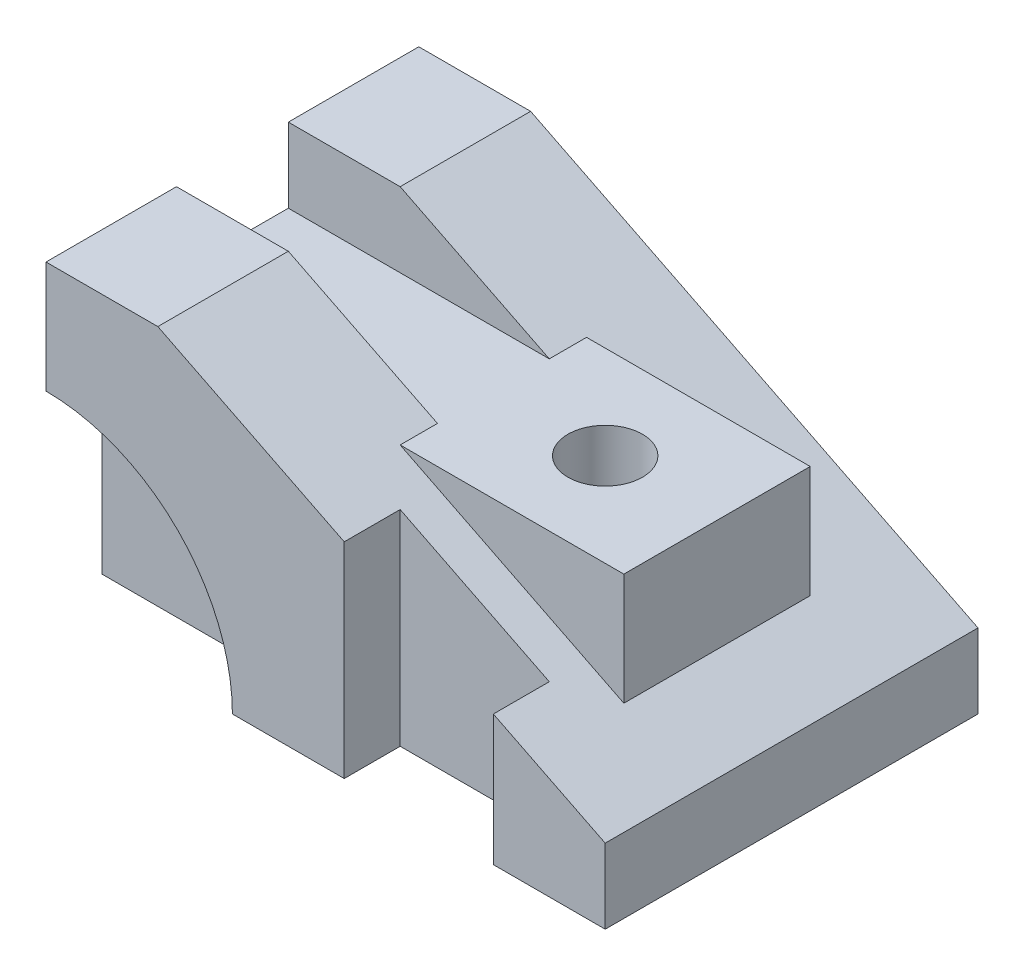
ISO-10303-21;
HEADER;
FILE_DESCRIPTION(('STEP AP214'),'2;1');
FILE_NAME('part.step','',(''),(''),'','','');
FILE_SCHEMA(('AUTOMOTIVE_DESIGN { 1 0 10303 214 1 1 1 1 }'));
ENDSEC;
DATA;
#1=APPLICATION_CONTEXT('core data for automotive mechanical design processes');
#2=APPLICATION_PROTOCOL_DEFINITION('international standard','automotive_design',2000,#1);
#3=PRODUCT_CONTEXT('',#1,'mechanical');
#4=PRODUCT('Part','Part','',(#3));
#5=PRODUCT_RELATED_PRODUCT_CATEGORY('part','',(#4));
#6=PRODUCT_DEFINITION_FORMATION('','',#4);
#7=PRODUCT_DEFINITION_CONTEXT('part definition',#1,'design');
#8=PRODUCT_DEFINITION('design','',#6,#7);
#9=PRODUCT_DEFINITION_SHAPE('','',#8);
#10=(LENGTH_UNIT() NAMED_UNIT(*) SI_UNIT(.MILLI.,.METRE.));
#11=(NAMED_UNIT(*) PLANE_ANGLE_UNIT() SI_UNIT($,.RADIAN.));
#12=(NAMED_UNIT(*) SI_UNIT($,.STERADIAN.) SOLID_ANGLE_UNIT());
#13=UNCERTAINTY_MEASURE_WITH_UNIT(LENGTH_MEASURE(1.E-05),#10,'distance_accuracy_value','');
#14=(GEOMETRIC_REPRESENTATION_CONTEXT(3) GLOBAL_UNCERTAINTY_ASSIGNED_CONTEXT((#13)) GLOBAL_UNIT_ASSIGNED_CONTEXT((#10,
#11,#12)) REPRESENTATION_CONTEXT('',''));
#15=CARTESIAN_POINT('',(0.,0.,0.));
#16=DIRECTION('',(0.,0.,1.));
#17=DIRECTION('',(1.,0.,0.));
#18=AXIS2_PLACEMENT_3D('',#15,#16,#17);
#19=CARTESIAN_POINT('',(0.,0.,50.));
#20=DIRECTION('',(0.,0.,1.));
#21=DIRECTION('',(1.,0.,0.));
#22=AXIS2_PLACEMENT_3D('',#19,#20,#21);
#23=PLANE('',#22);
#24=DIRECTION('',(0.,-1.,0.));
#25=VECTOR('',#24,1.);
#26=CARTESIAN_POINT('',(80.,0.,50.));
#27=LINE('',#26,#25);
#28=CARTESIAN_POINT('',(80.,55.,50.));
#29=VERTEX_POINT('',#28);
#30=CARTESIAN_POINT('',(80.,0.,50.));
#31=VERTEX_POINT('',#30);
#32=EDGE_CURVE('E53',#29,#31,#27,.T.);
#33=ORIENTED_EDGE('',*,*,#32,.F.);
#34=DIRECTION('',(-0.894427190999916,0.447213595499958,0.));
#35=VECTOR('',#34,1.);
#36=CARTESIAN_POINT('',(150.,20.,50.));
#37=LINE('',#36,#35);
#38=CARTESIAN_POINT('',(30.,80.,50.));
#39=VERTEX_POINT('',#38);
#40=EDGE_CURVE('E334',#29,#39,#37,.T.);
#41=ORIENTED_EDGE('',*,*,#40,.T.);
#42=DIRECTION('',(-1.,0.,0.));
#43=VECTOR('',#42,1.);
#44=CARTESIAN_POINT('',(30.,80.,50.));
#45=LINE('',#44,#43);
#46=CARTESIAN_POINT('',(0.,80.,50.));
#47=VERTEX_POINT('',#46);
#48=EDGE_CURVE('E339',#39,#47,#45,.T.);
#49=ORIENTED_EDGE('',*,*,#48,.T.);
#50=DIRECTION('',(0.,-1.,0.));
#51=VECTOR('',#50,1.);
#52=CARTESIAN_POINT('',(0.,80.,50.));
#53=LINE('',#52,#51);
#54=CARTESIAN_POINT('',(0.,50.,50.));
#55=VERTEX_POINT('',#54);
#56=EDGE_CURVE('E323',#47,#55,#53,.T.);
#57=ORIENTED_EDGE('',*,*,#56,.T.);
#58=CARTESIAN_POINT('',(0.,0.,50.));
#59=DIRECTION('',(0.,0.,1.));
#60=DIRECTION('',(1.,0.,0.));
#61=AXIS2_PLACEMENT_3D('',#58,#59,#60);
#62=CIRCLE('',#61,50.);
#63=CARTESIAN_POINT('',(50.,0.,50.));
#64=VERTEX_POINT('',#63);
#65=EDGE_CURVE('E278',#64,#55,#62,.T.);
#66=ORIENTED_EDGE('',*,*,#65,.F.);
#67=DIRECTION('',(1.,0.,0.));
#68=VECTOR('',#67,1.);
#69=CARTESIAN_POINT('',(0.,0.,50.));
#70=LINE('',#69,#68);
#71=EDGE_CURVE('E328',#64,#31,#70,.T.);
#72=ORIENTED_EDGE('',*,*,#71,.T.);
#73=EDGE_LOOP('',(#33,#41,#49,#57,#66,#72));
#74=FACE_BOUND('',#73,.T.);
#75=ADVANCED_FACE('F44',(#74),#23,.T.);
#76=CARTESIAN_POINT('',(30.,80.,50.));
#77=DIRECTION('',(0.,-1.,0.));
#78=DIRECTION('',(0.,0.,-1.));
#79=AXIS2_PLACEMENT_3D('',#76,#77,#78);
#80=PLANE('',#79);
#81=DIRECTION('',(0.,0.,-1.));
#82=VECTOR('',#81,1.);
#83=CARTESIAN_POINT('',(0.,80.,50.));
#84=LINE('',#83,#82);
#85=CARTESIAN_POINT('',(0.,80.,-15.));
#86=VERTEX_POINT('',#85);
#87=CARTESIAN_POINT('',(0.,80.,-50.));
#88=VERTEX_POINT('',#87);
#89=EDGE_CURVE('E342',#86,#88,#84,.T.);
#90=ORIENTED_EDGE('',*,*,#89,.F.);
#91=DIRECTION('',(-1.,0.,0.));
#92=VECTOR('',#91,1.);
#93=CARTESIAN_POINT('',(-50.1583754626268,80.,-15.));
#94=LINE('',#93,#92);
#95=CARTESIAN_POINT('',(30.,80.,-15.));
#96=VERTEX_POINT('',#95);
#97=EDGE_CURVE('E216',#96,#86,#94,.T.);
#98=ORIENTED_EDGE('',*,*,#97,.F.);
#99=DIRECTION('',(0.,0.,-1.));
#100=VECTOR('',#99,1.);
#101=CARTESIAN_POINT('',(30.,80.,50.));
#102=LINE('',#101,#100);
#103=CARTESIAN_POINT('',(30.,80.,-50.));
#104=VERTEX_POINT('',#103);
#105=EDGE_CURVE('E347',#96,#104,#102,.T.);
#106=ORIENTED_EDGE('',*,*,#105,.T.);
#107=DIRECTION('',(-1.,0.,0.));
#108=VECTOR('',#107,1.);
#109=CARTESIAN_POINT('',(30.,80.,-50.));
#110=LINE('',#109,#108);
#111=EDGE_CURVE('E319',#104,#88,#110,.T.);
#112=ORIENTED_EDGE('',*,*,#111,.T.);
#113=EDGE_LOOP('',(#90,#98,#106,#112));
#114=FACE_BOUND('',#113,.T.);
#115=ADVANCED_FACE('F392',(#114),#80,.F.);
#116=CARTESIAN_POINT('',(0.,80.,50.));
#117=DIRECTION('',(1.,0.,0.));
#118=DIRECTION('',(0.,1.,0.));
#119=AXIS2_PLACEMENT_3D('',#116,#117,#118);
#120=PLANE('',#119);
#121=DIRECTION('',(0.,0.,1.));
#122=VECTOR('',#121,1.);
#123=CARTESIAN_POINT('',(0.,60.,50.));
#124=LINE('',#123,#122);
#125=CARTESIAN_POINT('',(0.,60.,-15.));
#126=VERTEX_POINT('',#125);
#127=CARTESIAN_POINT('',(0.,60.,15.));
#128=VERTEX_POINT('',#127);
#129=EDGE_CURVE('E238',#126,#128,#124,.T.);
#130=ORIENTED_EDGE('',*,*,#129,.F.);
#131=DIRECTION('',(0.,1.,0.));
#132=VECTOR('',#131,1.);
#133=CARTESIAN_POINT('',(0.,80.,-15.));
#134=LINE('',#133,#132);
#135=EDGE_CURVE('E234',#126,#86,#134,.T.);
#136=ORIENTED_EDGE('',*,*,#135,.T.);
#137=ORIENTED_EDGE('',*,*,#89,.T.);
#138=DIRECTION('',(0.,-1.,0.));
#139=VECTOR('',#138,1.);
#140=CARTESIAN_POINT('',(0.,80.,-50.));
#141=LINE('',#140,#139);
#142=CARTESIAN_POINT('',(0.,0.,-50.));
#143=VERTEX_POINT('',#142);
#144=EDGE_CURVE('E303',#88,#143,#141,.T.);
#145=ORIENTED_EDGE('',*,*,#144,.T.);
#146=DIRECTION('',(0.,0.,-1.));
#147=VECTOR('',#146,1.);
#148=CARTESIAN_POINT('',(0.,0.,50.));
#149=LINE('',#148,#147);
#150=CARTESIAN_POINT('',(0.,0.,35.));
#151=VERTEX_POINT('',#150);
#152=EDGE_CURVE('E358',#151,#143,#149,.T.);
#153=ORIENTED_EDGE('',*,*,#152,.F.);
#154=DIRECTION('',(0.,-1.,0.));
#155=VECTOR('',#154,1.);
#156=CARTESIAN_POINT('',(0.,80.,35.));
#157=LINE('',#156,#155);
#158=CARTESIAN_POINT('',(0.,50.,35.));
#159=VERTEX_POINT('',#158);
#160=EDGE_CURVE('E300',#159,#151,#157,.T.);
#161=ORIENTED_EDGE('',*,*,#160,.F.);
#162=DIRECTION('',(0.,0.,1.));
#163=VECTOR('',#162,1.);
#164=CARTESIAN_POINT('',(0.,50.,35.));
#165=LINE('',#164,#163);
#166=EDGE_CURVE('E296',#159,#55,#165,.T.);
#167=ORIENTED_EDGE('',*,*,#166,.T.);
#168=ORIENTED_EDGE('',*,*,#56,.F.);
#169=CARTESIAN_POINT('',(0.,80.,15.));
#170=VERTEX_POINT('',#169);
#171=EDGE_CURVE('E343',#47,#170,#84,.T.);
#172=ORIENTED_EDGE('',*,*,#171,.T.);
#173=DIRECTION('',(0.,-1.,0.));
#174=VECTOR('',#173,1.);
#175=CARTESIAN_POINT('',(0.,80.,15.));
#176=LINE('',#175,#174);
#177=EDGE_CURVE('E68',#170,#128,#176,.T.);
#178=ORIENTED_EDGE('',*,*,#177,.T.);
#179=EDGE_LOOP('',(#130,#136,#137,#145,#153,#161,#167,#168,#172,#178));
#180=FACE_BOUND('',#179,.T.);
#181=ADVANCED_FACE('F46',(#180),#120,.F.);
#182=CARTESIAN_POINT('',(0.,0.,50.));
#183=DIRECTION('',(0.,1.,0.));
#184=DIRECTION('',(0.,0.,1.));
#185=AXIS2_PLACEMENT_3D('',#182,#183,#184);
#186=PLANE('',#185);
#187=CARTESIAN_POINT('',(100.,0.,0.));
#188=DIRECTION('',(0.,1.,0.));
#189=DIRECTION('',(0.,0.,1.));
#190=AXIS2_PLACEMENT_3D('',#187,#188,#189);
#191=CIRCLE('',#190,9.99999999999999);
#192=CARTESIAN_POINT('',(100.,0.,9.99999999999999));
#193=VERTEX_POINT('',#192);
#194=EDGE_CURVE('E242',#193,#193,#191,.T.);
#195=ORIENTED_EDGE('',*,*,#194,.T.);
#196=EDGE_LOOP('',(#195));
#197=FACE_BOUND('',#196,.T.);
#198=DIRECTION('',(1.,0.,0.));
#199=VECTOR('',#198,1.);
#200=CARTESIAN_POINT('',(80.,0.,35.));
#201=LINE('',#200,#199);
#202=CARTESIAN_POINT('',(80.,0.,35.));
#203=VERTEX_POINT('',#202);
#204=CARTESIAN_POINT('',(120.,0.,35.));
#205=VERTEX_POINT('',#204);
#206=EDGE_CURVE('E176',#203,#205,#201,.T.);
#207=ORIENTED_EDGE('',*,*,#206,.F.);
#208=DIRECTION('',(0.,0.,1.));
#209=VECTOR('',#208,1.);
#210=CARTESIAN_POINT('',(80.,0.,35.));
#211=LINE('',#210,#209);
#212=EDGE_CURVE('E183',#203,#31,#211,.T.);
#213=ORIENTED_EDGE('',*,*,#212,.T.);
#214=ORIENTED_EDGE('',*,*,#71,.F.);
#215=DIRECTION('',(0.,0.,1.));
#216=VECTOR('',#215,1.);
#217=CARTESIAN_POINT('',(50.,0.,35.));
#218=LINE('',#217,#216);
#219=CARTESIAN_POINT('',(50.,0.,35.));
#220=VERTEX_POINT('',#219);
#221=EDGE_CURVE('E290',#64,#220,#218,.F.);
#222=ORIENTED_EDGE('',*,*,#221,.T.);
#223=DIRECTION('',(1.,0.,0.));
#224=VECTOR('',#223,1.);
#225=CARTESIAN_POINT('',(0.,0.,35.));
#226=LINE('',#225,#224);
#227=EDGE_CURVE('E361',#151,#220,#226,.T.);
#228=ORIENTED_EDGE('',*,*,#227,.F.);
#229=ORIENTED_EDGE('',*,*,#152,.T.);
#230=DIRECTION('',(1.,0.,0.));
#231=VECTOR('',#230,1.);
#232=CARTESIAN_POINT('',(0.,0.,-50.));
#233=LINE('',#232,#231);
#234=CARTESIAN_POINT('',(150.,0.,-50.));
#235=VERTEX_POINT('',#234);
#236=EDGE_CURVE('E307',#143,#235,#233,.T.);
#237=ORIENTED_EDGE('',*,*,#236,.T.);
#238=DIRECTION('',(0.,0.,-1.));
#239=VECTOR('',#238,1.);
#240=CARTESIAN_POINT('',(150.,0.,50.));
#241=LINE('',#240,#239);
#242=CARTESIAN_POINT('',(150.,0.,50.));
#243=VERTEX_POINT('',#242);
#244=EDGE_CURVE('E355',#243,#235,#241,.T.);
#245=ORIENTED_EDGE('',*,*,#244,.F.);
#246=CARTESIAN_POINT('',(120.,0.,50.));
#247=VERTEX_POINT('',#246);
#248=EDGE_CURVE('E327',#247,#243,#70,.T.);
#249=ORIENTED_EDGE('',*,*,#248,.F.);
#250=DIRECTION('',(0.,0.,1.));
#251=VECTOR('',#250,1.);
#252=CARTESIAN_POINT('',(120.,0.,35.));
#253=LINE('',#252,#251);
#254=EDGE_CURVE('E60',#205,#247,#253,.T.);
#255=ORIENTED_EDGE('',*,*,#254,.F.);
#256=EDGE_LOOP('',(#207,#213,#214,#222,#228,#229,#237,#245,#249,#255));
#257=FACE_BOUND('',#256,.T.);
#258=ADVANCED_FACE('F192',(#197,#257),#186,.F.);
#259=CARTESIAN_POINT('',(150.,0.,50.));
#260=DIRECTION('',(-1.,0.,0.));
#261=DIRECTION('',(0.,0.,1.));
#262=AXIS2_PLACEMENT_3D('',#259,#260,#261);
#263=PLANE('',#262);
#264=ORIENTED_EDGE('',*,*,#244,.T.);
#265=DIRECTION('',(0.,1.,0.));
#266=VECTOR('',#265,1.);
#267=CARTESIAN_POINT('',(150.,0.,-50.));
#268=LINE('',#267,#266);
#269=CARTESIAN_POINT('',(150.,20.,-50.));
#270=VERTEX_POINT('',#269);
#271=EDGE_CURVE('E311',#235,#270,#268,.T.);
#272=ORIENTED_EDGE('',*,*,#271,.T.);
#273=DIRECTION('',(0.,0.,-1.));
#274=VECTOR('',#273,1.);
#275=CARTESIAN_POINT('',(150.,20.,50.));
#276=LINE('',#275,#274);
#277=CARTESIAN_POINT('',(150.,20.,50.));
#278=VERTEX_POINT('',#277);
#279=EDGE_CURVE('E352',#278,#270,#276,.T.);
#280=ORIENTED_EDGE('',*,*,#279,.F.);
#281=DIRECTION('',(0.,1.,0.));
#282=VECTOR('',#281,1.);
#283=CARTESIAN_POINT('',(150.,0.,50.));
#284=LINE('',#283,#282);
#285=EDGE_CURVE('E331',#243,#278,#284,.T.);
#286=ORIENTED_EDGE('',*,*,#285,.F.);
#287=EDGE_LOOP('',(#264,#272,#280,#286));
#288=FACE_BOUND('',#287,.T.);
#289=ADVANCED_FACE('F426',(#288),#263,.F.);
#290=CARTESIAN_POINT('',(150.,20.,50.));
#291=DIRECTION('',(-0.447213595499958,-0.894427190999916,0.));
#292=DIRECTION('',(0.894427190999916,-0.447213595499958,0.));
#293=AXIS2_PLACEMENT_3D('',#290,#291,#292);
#294=PLANE('',#293);
#295=ORIENTED_EDGE('',*,*,#40,.F.);
#296=DIRECTION('',(0.,0.,-1.));
#297=VECTOR('',#296,1.);
#298=CARTESIAN_POINT('',(80.,55.,50.));
#299=LINE('',#298,#297);
#300=CARTESIAN_POINT('',(80.,55.,35.));
#301=VERTEX_POINT('',#300);
#302=EDGE_CURVE('E207',#29,#301,#299,.T.);
#303=ORIENTED_EDGE('',*,*,#302,.T.);
#304=DIRECTION('',(0.894427190999916,-0.447213595499958,0.));
#305=VECTOR('',#304,1.);
#306=CARTESIAN_POINT('',(150.,20.,35.));
#307=LINE('',#306,#305);
#308=CARTESIAN_POINT('',(120.,35.,35.));
#309=VERTEX_POINT('',#308);
#310=EDGE_CURVE('E11',#301,#309,#307,.T.);
#311=ORIENTED_EDGE('',*,*,#310,.T.);
#312=DIRECTION('',(0.,0.,1.));
#313=VECTOR('',#312,1.);
#314=CARTESIAN_POINT('',(120.,35.,50.));
#315=LINE('',#314,#313);
#316=CARTESIAN_POINT('',(120.,35.,50.));
#317=VERTEX_POINT('',#316);
#318=EDGE_CURVE('E202',#309,#317,#315,.T.);
#319=ORIENTED_EDGE('',*,*,#318,.T.);
#320=EDGE_CURVE('E335',#278,#317,#37,.T.);
#321=ORIENTED_EDGE('',*,*,#320,.F.);
#322=ORIENTED_EDGE('',*,*,#279,.T.);
#323=DIRECTION('',(-0.894427190999916,0.447213595499958,0.));
#324=VECTOR('',#323,1.);
#325=CARTESIAN_POINT('',(150.,20.,-50.));
#326=LINE('',#325,#324);
#327=EDGE_CURVE('E315',#270,#104,#326,.T.);
#328=ORIENTED_EDGE('',*,*,#327,.T.);
#329=ORIENTED_EDGE('',*,*,#105,.F.);
#330=DIRECTION('',(0.894427190999916,-0.447213595499958,0.));
#331=VECTOR('',#330,1.);
#332=CARTESIAN_POINT('',(150.,20.,-15.));
#333=LINE('',#332,#331);
#334=CARTESIAN_POINT('',(70.,60.,-15.));
#335=VERTEX_POINT('',#334);
#336=EDGE_CURVE('E230',#96,#335,#333,.T.);
#337=ORIENTED_EDGE('',*,*,#336,.T.);
#338=DIRECTION('',(0.,0.,1.));
#339=VECTOR('',#338,1.);
#340=CARTESIAN_POINT('',(70.,60.,-25.));
#341=LINE('',#340,#339);
#342=CARTESIAN_POINT('',(70.,60.,-25.));
#343=VERTEX_POINT('',#342);
#344=EDGE_CURVE('E274',#343,#335,#341,.T.);
#345=ORIENTED_EDGE('',*,*,#344,.F.);
#346=DIRECTION('',(0.894427190999916,-0.447213595499958,0.));
#347=VECTOR('',#346,1.);
#348=CARTESIAN_POINT('',(130.,30.,-25.));
#349=LINE('',#348,#347);
#350=CARTESIAN_POINT('',(130.,30.,-25.));
#351=VERTEX_POINT('',#350);
#352=EDGE_CURVE('E261',#343,#351,#349,.T.);
#353=ORIENTED_EDGE('',*,*,#352,.T.);
#354=DIRECTION('',(0.,0.,1.));
#355=VECTOR('',#354,1.);
#356=CARTESIAN_POINT('',(130.,30.,-25.));
#357=LINE('',#356,#355);
#358=CARTESIAN_POINT('',(130.,30.,25.));
#359=VERTEX_POINT('',#358);
#360=EDGE_CURVE('E273',#351,#359,#357,.T.);
#361=ORIENTED_EDGE('',*,*,#360,.T.);
#362=DIRECTION('',(0.894427190999916,-0.447213595499958,0.));
#363=VECTOR('',#362,1.);
#364=CARTESIAN_POINT('',(130.,30.,25.));
#365=LINE('',#364,#363);
#366=CARTESIAN_POINT('',(70.,60.,25.));
#367=VERTEX_POINT('',#366);
#368=EDGE_CURVE('E246',#367,#359,#365,.T.);
#369=ORIENTED_EDGE('',*,*,#368,.F.);
#370=CARTESIAN_POINT('',(70.,60.,15.));
#371=VERTEX_POINT('',#370);
#372=EDGE_CURVE('E279',#371,#367,#341,.T.);
#373=ORIENTED_EDGE('',*,*,#372,.F.);
#374=DIRECTION('',(-0.894427190999916,0.447213595499958,0.));
#375=VECTOR('',#374,1.);
#376=CARTESIAN_POINT('',(150.,20.,15.));
#377=LINE('',#376,#375);
#378=CARTESIAN_POINT('',(30.,80.,15.));
#379=VERTEX_POINT('',#378);
#380=EDGE_CURVE('E220',#371,#379,#377,.T.);
#381=ORIENTED_EDGE('',*,*,#380,.T.);
#382=EDGE_CURVE('E348',#39,#379,#102,.T.);
#383=ORIENTED_EDGE('',*,*,#382,.F.);
#384=EDGE_LOOP('',(#295,#303,#311,#319,#321,#322,#328,#329,#337,#345,#353,#361,#369,#373,#381,#383));
#385=FACE_BOUND('',#384,.T.);
#386=ADVANCED_FACE('F379',(#385),#294,.F.);
#387=ORIENTED_EDGE('',*,*,#382,.T.);
#388=DIRECTION('',(1.,0.,0.));
#389=VECTOR('',#388,1.);
#390=CARTESIAN_POINT('',(-50.1583754626268,80.,15.));
#391=LINE('',#390,#389);
#392=EDGE_CURVE('E210',#170,#379,#391,.T.);
#393=ORIENTED_EDGE('',*,*,#392,.F.);
#394=ORIENTED_EDGE('',*,*,#171,.F.);
#395=ORIENTED_EDGE('',*,*,#48,.F.);
#396=EDGE_LOOP('',(#387,#393,#394,#395));
#397=FACE_BOUND('',#396,.T.);
#398=ADVANCED_FACE('F418',(#397),#80,.F.);
#399=DIRECTION('',(0.,1.,0.));
#400=VECTOR('',#399,1.);
#401=CARTESIAN_POINT('',(120.,0.,50.));
#402=LINE('',#401,#400);
#403=EDGE_CURVE('E180',#247,#317,#402,.T.);
#404=ORIENTED_EDGE('',*,*,#403,.F.);
#405=ORIENTED_EDGE('',*,*,#248,.T.);
#406=ORIENTED_EDGE('',*,*,#285,.T.);
#407=ORIENTED_EDGE('',*,*,#320,.T.);
#408=EDGE_LOOP('',(#404,#405,#406,#407));
#409=FACE_BOUND('',#408,.T.);
#410=ADVANCED_FACE('F423',(#409),#23,.T.);
#411=CARTESIAN_POINT('',(0.,0.,-50.));
#412=DIRECTION('',(0.,0.,1.));
#413=DIRECTION('',(1.,0.,0.));
#414=AXIS2_PLACEMENT_3D('',#411,#412,#413);
#415=PLANE('',#414);
#416=ORIENTED_EDGE('',*,*,#144,.F.);
#417=ORIENTED_EDGE('',*,*,#111,.F.);
#418=ORIENTED_EDGE('',*,*,#327,.F.);
#419=ORIENTED_EDGE('',*,*,#271,.F.);
#420=ORIENTED_EDGE('',*,*,#236,.F.);
#421=EDGE_LOOP('',(#416,#417,#418,#419,#420));
#422=FACE_BOUND('',#421,.T.);
#423=ADVANCED_FACE('F400',(#422),#415,.F.);
#424=CARTESIAN_POINT('',(0.,0.,35.));
#425=DIRECTION('',(0.,0.,1.));
#426=DIRECTION('',(1.,0.,0.));
#427=AXIS2_PLACEMENT_3D('',#424,#425,#426);
#428=PLANE('',#427);
#429=ORIENTED_EDGE('',*,*,#160,.T.);
#430=ORIENTED_EDGE('',*,*,#227,.T.);
#431=CARTESIAN_POINT('',(0.,0.,35.));
#432=DIRECTION('',(0.,0.,1.));
#433=DIRECTION('',(1.,0.,0.));
#434=AXIS2_PLACEMENT_3D('',#431,#432,#433);
#435=CIRCLE('',#434,50.);
#436=EDGE_CURVE('E286',#220,#159,#435,.T.);
#437=ORIENTED_EDGE('',*,*,#436,.T.);
#438=EDGE_LOOP('',(#429,#430,#437));
#439=FACE_BOUND('',#438,.T.);
#440=ADVANCED_FACE('F409',(#439),#428,.T.);
#441=CARTESIAN_POINT('',(0.,0.,35.));
#442=DIRECTION('',(0.,0.,1.));
#443=DIRECTION('',(1.,0.,0.));
#444=AXIS2_PLACEMENT_3D('',#441,#442,#443);
#445=CYLINDRICAL_SURFACE('',#444,50.);
#446=ORIENTED_EDGE('',*,*,#436,.F.);
#447=ORIENTED_EDGE('',*,*,#221,.F.);
#448=ORIENTED_EDGE('',*,*,#65,.T.);
#449=ORIENTED_EDGE('',*,*,#166,.F.);
#450=EDGE_LOOP('',(#446,#447,#448,#449));
#451=FACE_BOUND('',#450,.T.);
#452=ADVANCED_FACE('F412',(#451),#445,.F.);
#453=CARTESIAN_POINT('',(70.,60.,-25.));
#454=DIRECTION('',(0.,1.,0.));
#455=DIRECTION('',(0.,0.,1.));
#456=AXIS2_PLACEMENT_3D('',#453,#454,#455);
#457=PLANE('',#456);
#458=ORIENTED_EDGE('',*,*,#344,.T.);
#459=DIRECTION('',(-1.,0.,0.));
#460=VECTOR('',#459,1.);
#461=CARTESIAN_POINT('',(-50.1583754626268,60.,-15.));
#462=LINE('',#461,#460);
#463=EDGE_CURVE('E215',#335,#126,#462,.T.);
#464=ORIENTED_EDGE('',*,*,#463,.T.);
#465=ORIENTED_EDGE('',*,*,#129,.T.);
#466=DIRECTION('',(1.,0.,0.));
#467=VECTOR('',#466,1.);
#468=CARTESIAN_POINT('',(-50.1583754626268,60.,15.));
#469=LINE('',#468,#467);
#470=EDGE_CURVE('E211',#128,#371,#469,.T.);
#471=ORIENTED_EDGE('',*,*,#470,.T.);
#472=ORIENTED_EDGE('',*,*,#372,.T.);
#473=DIRECTION('',(-1.,0.,0.));
#474=VECTOR('',#473,1.);
#475=CARTESIAN_POINT('',(70.,60.,25.));
#476=LINE('',#475,#474);
#477=CARTESIAN_POINT('',(130.,60.,25.));
#478=VERTEX_POINT('',#477);
#479=EDGE_CURVE('E257',#478,#367,#476,.T.);
#480=ORIENTED_EDGE('',*,*,#479,.F.);
#481=DIRECTION('',(0.,0.,1.));
#482=VECTOR('',#481,1.);
#483=CARTESIAN_POINT('',(130.,60.,-25.));
#484=LINE('',#483,#482);
#485=CARTESIAN_POINT('',(130.,60.,-25.));
#486=VERTEX_POINT('',#485);
#487=EDGE_CURVE('E280',#486,#478,#484,.T.);
#488=ORIENTED_EDGE('',*,*,#487,.F.);
#489=DIRECTION('',(-1.,0.,0.));
#490=VECTOR('',#489,1.);
#491=CARTESIAN_POINT('',(70.,60.,-25.));
#492=LINE('',#491,#490);
#493=EDGE_CURVE('E269',#486,#343,#492,.T.);
#494=ORIENTED_EDGE('',*,*,#493,.T.);
#495=EDGE_LOOP('',(#458,#464,#465,#471,#472,#480,#488,#494));
#496=FACE_BOUND('',#495,.T.);
#497=CARTESIAN_POINT('',(100.,60.,0.));
#498=DIRECTION('',(0.,1.,0.));
#499=DIRECTION('',(0.,0.,1.));
#500=AXIS2_PLACEMENT_3D('',#497,#498,#499);
#501=CIRCLE('',#500,9.99999999999999);
#502=CARTESIAN_POINT('',(100.,60.,9.99999999999999));
#503=VERTEX_POINT('',#502);
#504=EDGE_CURVE('E241',#503,#503,#501,.T.);
#505=ORIENTED_EDGE('',*,*,#504,.F.);
#506=EDGE_LOOP('',(#505));
#507=FACE_BOUND('',#506,.T.);
#508=ADVANCED_FACE('F372',(#496,#507),#457,.T.);
#509=CARTESIAN_POINT('',(130.,60.,-25.));
#510=DIRECTION('',(1.,0.,0.));
#511=DIRECTION('',(0.,0.,-1.));
#512=AXIS2_PLACEMENT_3D('',#509,#510,#511);
#513=PLANE('',#512);
#514=ORIENTED_EDGE('',*,*,#487,.T.);
#515=DIRECTION('',(0.,1.,0.));
#516=VECTOR('',#515,1.);
#517=CARTESIAN_POINT('',(130.,60.,25.));
#518=LINE('',#517,#516);
#519=EDGE_CURVE('E253',#359,#478,#518,.T.);
#520=ORIENTED_EDGE('',*,*,#519,.F.);
#521=ORIENTED_EDGE('',*,*,#360,.F.);
#522=DIRECTION('',(0.,1.,0.));
#523=VECTOR('',#522,1.);
#524=CARTESIAN_POINT('',(130.,60.,-25.));
#525=LINE('',#524,#523);
#526=EDGE_CURVE('E265',#351,#486,#525,.T.);
#527=ORIENTED_EDGE('',*,*,#526,.T.);
#528=EDGE_LOOP('',(#514,#520,#521,#527));
#529=FACE_BOUND('',#528,.T.);
#530=ADVANCED_FACE('F383',(#529),#513,.T.);
#531=CARTESIAN_POINT('',(0.,0.,-25.));
#532=DIRECTION('',(0.,0.,1.));
#533=DIRECTION('',(1.,0.,0.));
#534=AXIS2_PLACEMENT_3D('',#531,#532,#533);
#535=PLANE('',#534);
#536=ORIENTED_EDGE('',*,*,#352,.F.);
#537=ORIENTED_EDGE('',*,*,#493,.F.);
#538=ORIENTED_EDGE('',*,*,#526,.F.);
#539=EDGE_LOOP('',(#536,#537,#538));
#540=FACE_BOUND('',#539,.T.);
#541=ADVANCED_FACE('F515',(#540),#535,.F.);
#542=CARTESIAN_POINT('',(0.,0.,25.));
#543=DIRECTION('',(0.,0.,1.));
#544=DIRECTION('',(1.,0.,0.));
#545=AXIS2_PLACEMENT_3D('',#542,#543,#544);
#546=PLANE('',#545);
#547=ORIENTED_EDGE('',*,*,#368,.T.);
#548=ORIENTED_EDGE('',*,*,#519,.T.);
#549=ORIENTED_EDGE('',*,*,#479,.T.);
#550=EDGE_LOOP('',(#547,#548,#549));
#551=FACE_BOUND('',#550,.T.);
#552=ADVANCED_FACE('F377',(#551),#546,.T.);
#553=CARTESIAN_POINT('',(100.,0.,0.));
#554=DIRECTION('',(0.,1.,0.));
#555=DIRECTION('',(0.,0.,1.));
#556=AXIS2_PLACEMENT_3D('',#553,#554,#555);
#557=CYLINDRICAL_SURFACE('',#556,9.99999999999999);
#558=ORIENTED_EDGE('',*,*,#194,.F.);
#559=EDGE_LOOP('',(#558));
#560=FACE_BOUND('',#559,.T.);
#561=ORIENTED_EDGE('',*,*,#504,.T.);
#562=EDGE_LOOP('',(#561));
#563=FACE_BOUND('',#562,.T.);
#564=ADVANCED_FACE('F469',(#560,#563),#557,.F.);
#565=CARTESIAN_POINT('',(-50.1583754626268,60.,-15.));
#566=DIRECTION('',(0.,0.,-1.));
#567=DIRECTION('',(-1.,0.,0.));
#568=AXIS2_PLACEMENT_3D('',#565,#566,#567);
#569=PLANE('',#568);
#570=ORIENTED_EDGE('',*,*,#463,.F.);
#571=ORIENTED_EDGE('',*,*,#336,.F.);
#572=ORIENTED_EDGE('',*,*,#97,.T.);
#573=ORIENTED_EDGE('',*,*,#135,.F.);
#574=EDGE_LOOP('',(#570,#571,#572,#573));
#575=FACE_BOUND('',#574,.T.);
#576=ADVANCED_FACE('F389',(#575),#569,.F.);
#577=CARTESIAN_POINT('',(-50.1583754626268,60.,15.));
#578=DIRECTION('',(0.,0.,1.));
#579=DIRECTION('',(1.,0.,0.));
#580=AXIS2_PLACEMENT_3D('',#577,#578,#579);
#581=PLANE('',#580);
#582=ORIENTED_EDGE('',*,*,#392,.T.);
#583=ORIENTED_EDGE('',*,*,#380,.F.);
#584=ORIENTED_EDGE('',*,*,#470,.F.);
#585=ORIENTED_EDGE('',*,*,#177,.F.);
#586=EDGE_LOOP('',(#582,#583,#584,#585));
#587=FACE_BOUND('',#586,.T.);
#588=ADVANCED_FACE('F420',(#587),#581,.F.);
#589=CARTESIAN_POINT('',(0.,0.,35.));
#590=DIRECTION('',(0.,0.,-1.));
#591=DIRECTION('',(-1.,0.,0.));
#592=AXIS2_PLACEMENT_3D('',#589,#590,#591);
#593=PLANE('',#592);
#594=DIRECTION('',(0.,-1.,0.));
#595=VECTOR('',#594,1.);
#596=CARTESIAN_POINT('',(80.,0.,35.));
#597=LINE('',#596,#595);
#598=EDGE_CURVE('E171',#301,#203,#597,.T.);
#599=ORIENTED_EDGE('',*,*,#598,.T.);
#600=ORIENTED_EDGE('',*,*,#206,.T.);
#601=DIRECTION('',(0.,1.,0.));
#602=VECTOR('',#601,1.);
#603=CARTESIAN_POINT('',(120.,0.,35.));
#604=LINE('',#603,#602);
#605=EDGE_CURVE('E190',#205,#309,#604,.T.);
#606=ORIENTED_EDGE('',*,*,#605,.T.);
#607=ORIENTED_EDGE('',*,*,#310,.F.);
#608=EDGE_LOOP('',(#599,#600,#606,#607));
#609=FACE_BOUND('',#608,.T.);
#610=ADVANCED_FACE('F173',(#609),#593,.F.);
#611=CARTESIAN_POINT('',(80.,0.,35.));
#612=DIRECTION('',(-1.,0.,0.));
#613=DIRECTION('',(0.,0.,1.));
#614=AXIS2_PLACEMENT_3D('',#611,#612,#613);
#615=PLANE('',#614);
#616=ORIENTED_EDGE('',*,*,#32,.T.);
#617=ORIENTED_EDGE('',*,*,#212,.F.);
#618=ORIENTED_EDGE('',*,*,#598,.F.);
#619=ORIENTED_EDGE('',*,*,#302,.F.);
#620=EDGE_LOOP('',(#616,#617,#618,#619));
#621=FACE_BOUND('',#620,.T.);
#622=ADVANCED_FACE('F184',(#621),#615,.F.);
#623=CARTESIAN_POINT('',(120.,0.,35.));
#624=DIRECTION('',(1.,0.,0.));
#625=DIRECTION('',(0.,0.,-1.));
#626=AXIS2_PLACEMENT_3D('',#623,#624,#625);
#627=PLANE('',#626);
#628=ORIENTED_EDGE('',*,*,#605,.F.);
#629=ORIENTED_EDGE('',*,*,#254,.T.);
#630=ORIENTED_EDGE('',*,*,#403,.T.);
#631=ORIENTED_EDGE('',*,*,#318,.F.);
#632=EDGE_LOOP('',(#628,#629,#630,#631));
#633=FACE_BOUND('',#632,.T.);
#634=ADVANCED_FACE('F498',(#633),#627,.F.);
#635=CLOSED_SHELL('',(#75,#115,#181,#258,#289,#386,#398,#410,#423,#440,#452,#508,#530,#541,#552,
#564,#576,#588,#610,#622,#634));
#636=MANIFOLD_SOLID_BREP('B2',#635);
#637=ADVANCED_BREP_SHAPE_REPRESENTATION('',(#18,#636),#14);
#638=SHAPE_DEFINITION_REPRESENTATION(#9,#637);
ENDSEC;
END-ISO-10303-21;
